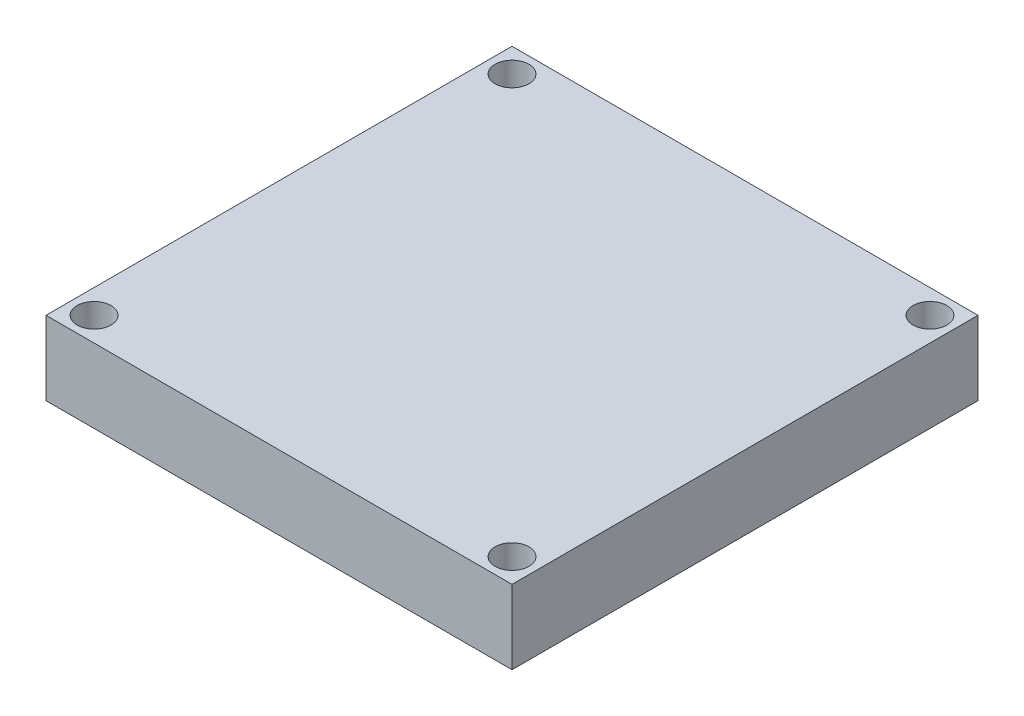
ISO-10303-21;
HEADER;
FILE_DESCRIPTION(('STEP AP214'),'2;1');
FILE_NAME('part.step','',(''),(''),'','','');
FILE_SCHEMA(('AUTOMOTIVE_DESIGN { 1 0 10303 214 1 1 1 1 }'));
ENDSEC;
DATA;
#1=APPLICATION_CONTEXT('core data for automotive mechanical design processes');
#2=APPLICATION_PROTOCOL_DEFINITION('international standard','automotive_design',2000,#1);
#3=PRODUCT_CONTEXT('',#1,'mechanical');
#4=PRODUCT('Part','Part','',(#3));
#5=PRODUCT_RELATED_PRODUCT_CATEGORY('part','',(#4));
#6=PRODUCT_DEFINITION_FORMATION('','',#4);
#7=PRODUCT_DEFINITION_CONTEXT('part definition',#1,'design');
#8=PRODUCT_DEFINITION('design','',#6,#7);
#9=PRODUCT_DEFINITION_SHAPE('','',#8);
#10=(LENGTH_UNIT() NAMED_UNIT(*) SI_UNIT(.MILLI.,.METRE.));
#11=(NAMED_UNIT(*) PLANE_ANGLE_UNIT() SI_UNIT($,.RADIAN.));
#12=(NAMED_UNIT(*) SI_UNIT($,.STERADIAN.) SOLID_ANGLE_UNIT());
#13=UNCERTAINTY_MEASURE_WITH_UNIT(LENGTH_MEASURE(1.E-05),#10,'distance_accuracy_value','');
#14=(GEOMETRIC_REPRESENTATION_CONTEXT(3) GLOBAL_UNCERTAINTY_ASSIGNED_CONTEXT((#13)) GLOBAL_UNIT_ASSIGNED_CONTEXT((#10,
#11,#12)) REPRESENTATION_CONTEXT('',''));
#15=CARTESIAN_POINT('',(0.,0.,0.));
#16=DIRECTION('',(0.,0.,1.));
#17=DIRECTION('',(1.,0.,0.));
#18=AXIS2_PLACEMENT_3D('',#15,#16,#17);
#19=CARTESIAN_POINT('',(0.,12.7,0.));
#20=DIRECTION('',(0.,-1.,0.));
#21=DIRECTION('',(0.,0.,-1.));
#22=AXIS2_PLACEMENT_3D('',#19,#20,#21);
#23=PLANE('',#22);
#24=CARTESIAN_POINT('',(35.8775000000001,12.7,35.8774999999997));
#25=DIRECTION('',(0.,1.,0.));
#26=DIRECTION('',(0.,0.,1.));
#27=AXIS2_PLACEMENT_3D('',#24,#25,#26);
#28=CIRCLE('',#27,2.9083);
#29=CARTESIAN_POINT('',(35.8775000000001,12.7,38.7857999999997));
#30=VERTEX_POINT('',#29);
#31=EDGE_CURVE('E138',#30,#30,#28,.T.);
#32=ORIENTED_EDGE('',*,*,#31,.F.);
#33=EDGE_LOOP('',(#32));
#34=FACE_BOUND('',#33,.T.);
#35=CARTESIAN_POINT('',(-35.8775,12.7,-35.8775));
#36=DIRECTION('',(0.,1.,0.));
#37=DIRECTION('',(0.,0.,1.));
#38=AXIS2_PLACEMENT_3D('',#35,#36,#37);
#39=CIRCLE('',#38,2.9083);
#40=CARTESIAN_POINT('',(-35.8775,12.7,-32.9692));
#41=VERTEX_POINT('',#40);
#42=EDGE_CURVE('E120',#41,#41,#39,.T.);
#43=ORIENTED_EDGE('',*,*,#42,.F.);
#44=EDGE_LOOP('',(#43));
#45=FACE_BOUND('',#44,.T.);
#46=DIRECTION('',(0.,0.,-1.));
#47=VECTOR('',#46,1.);
#48=CARTESIAN_POINT('',(40.005,12.7,40.005));
#49=LINE('',#48,#47);
#50=CARTESIAN_POINT('',(40.005,12.7,40.005));
#51=VERTEX_POINT('',#50);
#52=CARTESIAN_POINT('',(40.005,12.7,-40.005));
#53=VERTEX_POINT('',#52);
#54=EDGE_CURVE('E93',#51,#53,#49,.T.);
#55=ORIENTED_EDGE('',*,*,#54,.T.);
#56=DIRECTION('',(-1.,0.,0.));
#57=VECTOR('',#56,1.);
#58=CARTESIAN_POINT('',(-40.005,12.7,-40.005));
#59=LINE('',#58,#57);
#60=CARTESIAN_POINT('',(-40.005,12.7,-40.005));
#61=VERTEX_POINT('',#60);
#62=EDGE_CURVE('E88',#53,#61,#59,.T.);
#63=ORIENTED_EDGE('',*,*,#62,.T.);
#64=DIRECTION('',(0.,0.,1.));
#65=VECTOR('',#64,1.);
#66=CARTESIAN_POINT('',(-40.005,12.7,40.005));
#67=LINE('',#66,#65);
#68=CARTESIAN_POINT('',(-40.005,12.7,40.005));
#69=VERTEX_POINT('',#68);
#70=EDGE_CURVE('E91',#61,#69,#67,.T.);
#71=ORIENTED_EDGE('',*,*,#70,.T.);
#72=DIRECTION('',(1.,0.,0.));
#73=VECTOR('',#72,1.);
#74=CARTESIAN_POINT('',(-40.005,12.7,40.005));
#75=LINE('',#74,#73);
#76=EDGE_CURVE('E58',#69,#51,#75,.T.);
#77=ORIENTED_EDGE('',*,*,#76,.T.);
#78=EDGE_LOOP('',(#55,#63,#71,#77));
#79=FACE_BOUND('',#78,.T.);
#80=CARTESIAN_POINT('',(-35.8774999999999,12.7,35.8775));
#81=DIRECTION('',(0.,1.,0.));
#82=DIRECTION('',(0.,0.,1.));
#83=AXIS2_PLACEMENT_3D('',#80,#81,#82);
#84=CIRCLE('',#83,2.90830000000001);
#85=CARTESIAN_POINT('',(-35.8774999999999,12.7,38.7858));
#86=VERTEX_POINT('',#85);
#87=EDGE_CURVE('E126',#86,#86,#84,.F.);
#88=ORIENTED_EDGE('',*,*,#87,.T.);
#89=EDGE_LOOP('',(#88));
#90=FACE_BOUND('',#89,.T.);
#91=CARTESIAN_POINT('',(35.8775,12.7,-35.8775));
#92=DIRECTION('',(0.,1.,0.));
#93=DIRECTION('',(0.,0.,1.));
#94=AXIS2_PLACEMENT_3D('',#91,#92,#93);
#95=CIRCLE('',#94,2.9083);
#96=CARTESIAN_POINT('',(35.8775,12.7,-32.9692));
#97=VERTEX_POINT('',#96);
#98=EDGE_CURVE('E133',#97,#97,#95,.F.);
#99=ORIENTED_EDGE('',*,*,#98,.T.);
#100=EDGE_LOOP('',(#99));
#101=FACE_BOUND('',#100,.T.);
#102=ADVANCED_FACE('F41',(#34,#45,#79,#90,#101),#23,.F.);
#103=CARTESIAN_POINT('',(0.,0.,0.));
#104=DIRECTION('',(0.,-1.,0.));
#105=DIRECTION('',(0.,0.,-1.));
#106=AXIS2_PLACEMENT_3D('',#103,#104,#105);
#107=PLANE('',#106);
#108=CARTESIAN_POINT('',(-35.8774999999999,0.,35.8775));
#109=DIRECTION('',(0.,1.,0.));
#110=DIRECTION('',(0.,0.,1.));
#111=AXIS2_PLACEMENT_3D('',#108,#109,#110);
#112=CIRCLE('',#111,2.90830000000001);
#113=CARTESIAN_POINT('',(-35.8774999999999,0.,38.7858));
#114=VERTEX_POINT('',#113);
#115=EDGE_CURVE('E129',#114,#114,#112,.F.);
#116=ORIENTED_EDGE('',*,*,#115,.F.);
#117=EDGE_LOOP('',(#116));
#118=FACE_BOUND('',#117,.T.);
#119=CARTESIAN_POINT('',(35.8775000000001,0.,35.8774999999997));
#120=DIRECTION('',(0.,1.,0.));
#121=DIRECTION('',(0.,0.,1.));
#122=AXIS2_PLACEMENT_3D('',#119,#120,#121);
#123=CIRCLE('',#122,2.9083);
#124=CARTESIAN_POINT('',(35.8775000000001,0.,38.7857999999997));
#125=VERTEX_POINT('',#124);
#126=EDGE_CURVE('E130',#125,#125,#123,.T.);
#127=ORIENTED_EDGE('',*,*,#126,.T.);
#128=EDGE_LOOP('',(#127));
#129=FACE_BOUND('',#128,.T.);
#130=CARTESIAN_POINT('',(-35.8775,0.,-35.8775));
#131=DIRECTION('',(0.,1.,0.));
#132=DIRECTION('',(0.,0.,1.));
#133=AXIS2_PLACEMENT_3D('',#130,#131,#132);
#134=CIRCLE('',#133,2.9083);
#135=CARTESIAN_POINT('',(-35.8775,0.,-32.9692));
#136=VERTEX_POINT('',#135);
#137=EDGE_CURVE('E108',#136,#136,#134,.T.);
#138=ORIENTED_EDGE('',*,*,#137,.T.);
#139=EDGE_LOOP('',(#138));
#140=FACE_BOUND('',#139,.T.);
#141=DIRECTION('',(0.,0.,-1.));
#142=VECTOR('',#141,1.);
#143=CARTESIAN_POINT('',(40.005,0.,40.005));
#144=LINE('',#143,#142);
#145=CARTESIAN_POINT('',(40.005,0.,40.005));
#146=VERTEX_POINT('',#145);
#147=CARTESIAN_POINT('',(40.005,0.,-40.005));
#148=VERTEX_POINT('',#147);
#149=EDGE_CURVE('E105',#146,#148,#144,.T.);
#150=ORIENTED_EDGE('',*,*,#149,.F.);
#151=DIRECTION('',(1.,0.,0.));
#152=VECTOR('',#151,1.);
#153=CARTESIAN_POINT('',(-40.005,0.,40.005));
#154=LINE('',#153,#152);
#155=CARTESIAN_POINT('',(-40.005,0.,40.005));
#156=VERTEX_POINT('',#155);
#157=EDGE_CURVE('E81',#156,#146,#154,.T.);
#158=ORIENTED_EDGE('',*,*,#157,.F.);
#159=DIRECTION('',(0.,0.,1.));
#160=VECTOR('',#159,1.);
#161=CARTESIAN_POINT('',(-40.005,0.,40.005));
#162=LINE('',#161,#160);
#163=CARTESIAN_POINT('',(-40.005,0.,-40.005));
#164=VERTEX_POINT('',#163);
#165=EDGE_CURVE('E75',#164,#156,#162,.T.);
#166=ORIENTED_EDGE('',*,*,#165,.F.);
#167=DIRECTION('',(-1.,0.,0.));
#168=VECTOR('',#167,1.);
#169=CARTESIAN_POINT('',(-40.005,0.,-40.005));
#170=LINE('',#169,#168);
#171=EDGE_CURVE('E97',#148,#164,#170,.T.);
#172=ORIENTED_EDGE('',*,*,#171,.F.);
#173=EDGE_LOOP('',(#150,#158,#166,#172));
#174=FACE_BOUND('',#173,.T.);
#175=CARTESIAN_POINT('',(35.8775,0.,-35.8775));
#176=DIRECTION('',(0.,1.,0.));
#177=DIRECTION('',(0.,0.,1.));
#178=AXIS2_PLACEMENT_3D('',#175,#176,#177);
#179=CIRCLE('',#178,2.9083);
#180=CARTESIAN_POINT('',(35.8775,0.,-32.9692));
#181=VERTEX_POINT('',#180);
#182=EDGE_CURVE('E123',#181,#181,#179,.F.);
#183=ORIENTED_EDGE('',*,*,#182,.F.);
#184=EDGE_LOOP('',(#183));
#185=FACE_BOUND('',#184,.T.);
#186=ADVANCED_FACE('F116',(#118,#129,#140,#174,#185),#107,.T.);
#187=CARTESIAN_POINT('',(40.005,12.7,40.005));
#188=DIRECTION('',(-1.,0.,0.));
#189=DIRECTION('',(0.,0.,1.));
#190=AXIS2_PLACEMENT_3D('',#187,#188,#189);
#191=PLANE('',#190);
#192=ORIENTED_EDGE('',*,*,#149,.T.);
#193=DIRECTION('',(0.,-1.,0.));
#194=VECTOR('',#193,1.);
#195=CARTESIAN_POINT('',(40.005,12.7,-40.005));
#196=LINE('',#195,#194);
#197=EDGE_CURVE('E11',#53,#148,#196,.T.);
#198=ORIENTED_EDGE('',*,*,#197,.F.);
#199=ORIENTED_EDGE('',*,*,#54,.F.);
#200=DIRECTION('',(0.,-1.,0.));
#201=VECTOR('',#200,1.);
#202=CARTESIAN_POINT('',(40.005,12.7,40.005));
#203=LINE('',#202,#201);
#204=EDGE_CURVE('E101',#51,#146,#203,.T.);
#205=ORIENTED_EDGE('',*,*,#204,.T.);
#206=EDGE_LOOP('',(#192,#198,#199,#205));
#207=FACE_BOUND('',#206,.T.);
#208=ADVANCED_FACE('F43',(#207),#191,.F.);
#209=CARTESIAN_POINT('',(-40.005,12.7,-40.005));
#210=DIRECTION('',(0.,0.,1.));
#211=DIRECTION('',(1.,0.,0.));
#212=AXIS2_PLACEMENT_3D('',#209,#210,#211);
#213=PLANE('',#212);
#214=ORIENTED_EDGE('',*,*,#171,.T.);
#215=DIRECTION('',(0.,-1.,0.));
#216=VECTOR('',#215,1.);
#217=CARTESIAN_POINT('',(-40.005,12.7,-40.005));
#218=LINE('',#217,#216);
#219=EDGE_CURVE('E50',#61,#164,#218,.T.);
#220=ORIENTED_EDGE('',*,*,#219,.F.);
#221=ORIENTED_EDGE('',*,*,#62,.F.);
#222=ORIENTED_EDGE('',*,*,#197,.T.);
#223=EDGE_LOOP('',(#214,#220,#221,#222));
#224=FACE_BOUND('',#223,.T.);
#225=ADVANCED_FACE('F96',(#224),#213,.F.);
#226=CARTESIAN_POINT('',(-40.005,12.7,40.005));
#227=DIRECTION('',(1.,0.,0.));
#228=DIRECTION('',(0.,0.,-1.));
#229=AXIS2_PLACEMENT_3D('',#226,#227,#228);
#230=PLANE('',#229);
#231=ORIENTED_EDGE('',*,*,#165,.T.);
#232=DIRECTION('',(0.,-1.,0.));
#233=VECTOR('',#232,1.);
#234=CARTESIAN_POINT('',(-40.005,12.7,40.005));
#235=LINE('',#234,#233);
#236=EDGE_CURVE('E98',#69,#156,#235,.T.);
#237=ORIENTED_EDGE('',*,*,#236,.F.);
#238=ORIENTED_EDGE('',*,*,#70,.F.);
#239=ORIENTED_EDGE('',*,*,#219,.T.);
#240=EDGE_LOOP('',(#231,#237,#238,#239));
#241=FACE_BOUND('',#240,.T.);
#242=ADVANCED_FACE('F99',(#241),#230,.F.);
#243=CARTESIAN_POINT('',(-40.005,12.7,40.005));
#244=DIRECTION('',(0.,0.,-1.));
#245=DIRECTION('',(-1.,0.,0.));
#246=AXIS2_PLACEMENT_3D('',#243,#244,#245);
#247=PLANE('',#246);
#248=ORIENTED_EDGE('',*,*,#157,.T.);
#249=ORIENTED_EDGE('',*,*,#204,.F.);
#250=ORIENTED_EDGE('',*,*,#76,.F.);
#251=ORIENTED_EDGE('',*,*,#236,.T.);
#252=EDGE_LOOP('',(#248,#249,#250,#251));
#253=FACE_BOUND('',#252,.T.);
#254=ADVANCED_FACE('F113',(#253),#247,.F.);
#255=CARTESIAN_POINT('',(-35.8775,0.,-35.8775));
#256=DIRECTION('',(0.,1.,0.));
#257=DIRECTION('',(0.,0.,1.));
#258=AXIS2_PLACEMENT_3D('',#255,#256,#257);
#259=CYLINDRICAL_SURFACE('',#258,2.9083);
#260=ORIENTED_EDGE('',*,*,#137,.F.);
#261=EDGE_LOOP('',(#260));
#262=FACE_BOUND('',#261,.T.);
#263=ORIENTED_EDGE('',*,*,#42,.T.);
#264=EDGE_LOOP('',(#263));
#265=FACE_BOUND('',#264,.T.);
#266=ADVANCED_FACE('F150',(#262,#265),#259,.F.);
#267=CARTESIAN_POINT('',(35.8775000000001,0.,35.8774999999997));
#268=DIRECTION('',(0.,1.,0.));
#269=DIRECTION('',(0.,0.,1.));
#270=AXIS2_PLACEMENT_3D('',#267,#268,#269);
#271=CYLINDRICAL_SURFACE('',#270,2.9083);
#272=ORIENTED_EDGE('',*,*,#126,.F.);
#273=EDGE_LOOP('',(#272));
#274=FACE_BOUND('',#273,.T.);
#275=ORIENTED_EDGE('',*,*,#31,.T.);
#276=EDGE_LOOP('',(#275));
#277=FACE_BOUND('',#276,.T.);
#278=ADVANCED_FACE('F146',(#274,#277),#271,.F.);
#279=CARTESIAN_POINT('',(-35.8774999999999,0.,35.8775));
#280=DIRECTION('',(0.,1.,0.));
#281=DIRECTION('',(0.,0.,1.));
#282=AXIS2_PLACEMENT_3D('',#279,#280,#281);
#283=CYLINDRICAL_SURFACE('',#282,2.90830000000001);
#284=ORIENTED_EDGE('',*,*,#115,.T.);
#285=EDGE_LOOP('',(#284));
#286=FACE_BOUND('',#285,.T.);
#287=ORIENTED_EDGE('',*,*,#87,.F.);
#288=EDGE_LOOP('',(#287));
#289=FACE_BOUND('',#288,.T.);
#290=ADVANCED_FACE('F149',(#286,#289),#283,.F.);
#291=CARTESIAN_POINT('',(35.8775,0.,-35.8775));
#292=DIRECTION('',(0.,1.,0.));
#293=DIRECTION('',(0.,0.,1.));
#294=AXIS2_PLACEMENT_3D('',#291,#292,#293);
#295=CYLINDRICAL_SURFACE('',#294,2.9083);
#296=ORIENTED_EDGE('',*,*,#182,.T.);
#297=EDGE_LOOP('',(#296));
#298=FACE_BOUND('',#297,.T.);
#299=ORIENTED_EDGE('',*,*,#98,.F.);
#300=EDGE_LOOP('',(#299));
#301=FACE_BOUND('',#300,.T.);
#302=ADVANCED_FACE('F226',(#298,#301),#295,.F.);
#303=CLOSED_SHELL('',(#102,#186,#208,#225,#242,#254,#266,#278,#290,#302));
#304=MANIFOLD_SOLID_BREP('B2',#303);
#305=ADVANCED_BREP_SHAPE_REPRESENTATION('',(#18,#304),#14);
#306=SHAPE_DEFINITION_REPRESENTATION(#9,#305);
ENDSEC;
END-ISO-10303-21;
